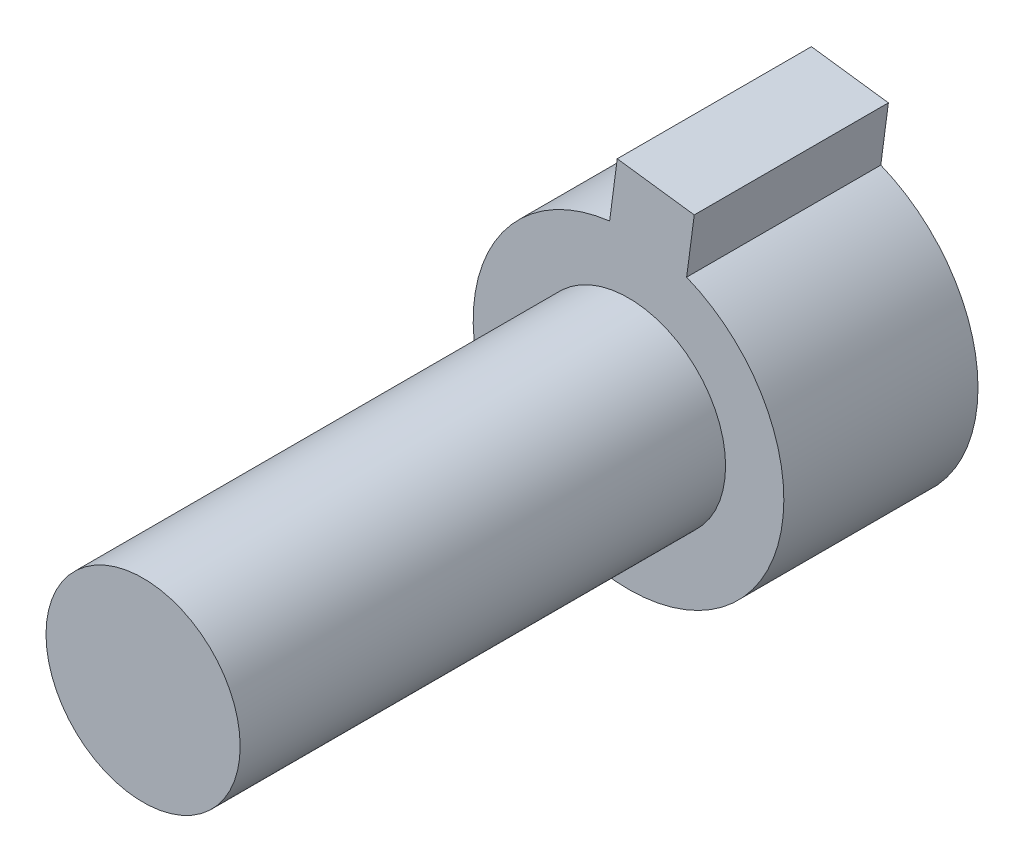
ISO-10303-21;
HEADER;
FILE_DESCRIPTION(('STEP AP214'),'2;1');
FILE_NAME('part.step','',(''),(''),'','','');
FILE_SCHEMA(('AUTOMOTIVE_DESIGN { 1 0 10303 214 1 1 1 1 }'));
ENDSEC;
DATA;
#1=APPLICATION_CONTEXT('core data for automotive mechanical design processes');
#2=APPLICATION_PROTOCOL_DEFINITION('international standard','automotive_design',2000,#1);
#3=PRODUCT_CONTEXT('',#1,'mechanical');
#4=PRODUCT('Part','Part','',(#3));
#5=PRODUCT_RELATED_PRODUCT_CATEGORY('part','',(#4));
#6=PRODUCT_DEFINITION_FORMATION('','',#4);
#7=PRODUCT_DEFINITION_CONTEXT('part definition',#1,'design');
#8=PRODUCT_DEFINITION('design','',#6,#7);
#9=PRODUCT_DEFINITION_SHAPE('','',#8);
#10=(LENGTH_UNIT() NAMED_UNIT(*) SI_UNIT(.MILLI.,.METRE.));
#11=(NAMED_UNIT(*) PLANE_ANGLE_UNIT() SI_UNIT($,.RADIAN.));
#12=(NAMED_UNIT(*) SI_UNIT($,.STERADIAN.) SOLID_ANGLE_UNIT());
#13=UNCERTAINTY_MEASURE_WITH_UNIT(LENGTH_MEASURE(1.E-05),#10,'distance_accuracy_value','');
#14=(GEOMETRIC_REPRESENTATION_CONTEXT(3) GLOBAL_UNCERTAINTY_ASSIGNED_CONTEXT((#13)) GLOBAL_UNIT_ASSIGNED_CONTEXT((#10,
#11,#12)) REPRESENTATION_CONTEXT('',''));
#15=CARTESIAN_POINT('',(0.,0.,0.));
#16=DIRECTION('',(0.,0.,1.));
#17=DIRECTION('',(1.,0.,0.));
#18=AXIS2_PLACEMENT_3D('',#15,#16,#17);
#19=CARTESIAN_POINT('',(3.38551983683199,10.3929810732487,10.));
#20=DIRECTION('',(-0.991444861373811,0.130526192220048,0.));
#21=DIRECTION('',(-0.130526192220048,-0.991444861373811,0.));
#22=AXIS2_PLACEMENT_3D('',#19,#20,#21);
#23=PLANE('',#22);
#24=DIRECTION('',(0.130526192220048,0.991444861373811,0.));
#25=VECTOR('',#24,1.);
#26=CARTESIAN_POINT('',(3.38551983683199,10.3929810732487,0.));
#27=LINE('',#26,#25);
#28=CARTESIAN_POINT('',(2.99394126017185,7.41864648912729,0.));
#29=VERTEX_POINT('',#28);
#30=CARTESIAN_POINT('',(3.38551983683199,10.3929810732487,0.));
#31=VERTEX_POINT('',#30);
#32=EDGE_CURVE('E95',#29,#31,#27,.T.);
#33=ORIENTED_EDGE('',*,*,#32,.T.);
#34=DIRECTION('',(0.,0.,-1.));
#35=VECTOR('',#34,1.);
#36=CARTESIAN_POINT('',(3.38551983683199,10.3929810732487,10.));
#37=LINE('',#36,#35);
#38=CARTESIAN_POINT('',(3.38551983683199,10.3929810732487,10.));
#39=VERTEX_POINT('',#38);
#40=EDGE_CURVE('E11',#39,#31,#37,.T.);
#41=ORIENTED_EDGE('',*,*,#40,.F.);
#42=DIRECTION('',(0.130526192220048,0.991444861373811,0.));
#43=VECTOR('',#42,1.);
#44=CARTESIAN_POINT('',(3.38551983683199,10.3929810732487,10.));
#45=LINE('',#44,#43);
#46=CARTESIAN_POINT('',(2.99394126017185,7.41864648912729,10.));
#47=VERTEX_POINT('',#46);
#48=EDGE_CURVE('E83',#47,#39,#45,.T.);
#49=ORIENTED_EDGE('',*,*,#48,.F.);
#50=DIRECTION('',(0.,0.,-1.));
#51=VECTOR('',#50,1.);
#52=CARTESIAN_POINT('',(2.99394126017185,7.41864648912729,10.));
#53=LINE('',#52,#51);
#54=EDGE_CURVE('E91',#47,#29,#53,.T.);
#55=ORIENTED_EDGE('',*,*,#54,.T.);
#56=EDGE_LOOP('',(#33,#41,#49,#55));
#57=FACE_BOUND('',#56,.T.);
#58=ADVANCED_FACE('F32',(#57),#23,.F.);
#59=CARTESIAN_POINT('',(-0.580259608663254,10.9150858421289,10.));
#60=DIRECTION('',(-0.130526192220048,-0.991444861373811,0.));
#61=DIRECTION('',(0.991444861373811,-0.130526192220048,0.));
#62=AXIS2_PLACEMENT_3D('',#59,#60,#61);
#63=PLANE('',#62);
#64=DIRECTION('',(-0.991444861373811,0.130526192220048,0.));
#65=VECTOR('',#64,1.);
#66=CARTESIAN_POINT('',(-0.580259608663254,10.9150858421289,0.));
#67=LINE('',#66,#65);
#68=CARTESIAN_POINT('',(-0.580259608663254,10.9150858421289,0.));
#69=VERTEX_POINT('',#68);
#70=EDGE_CURVE('E87',#31,#69,#67,.T.);
#71=ORIENTED_EDGE('',*,*,#70,.T.);
#72=DIRECTION('',(0.,0.,-1.));
#73=VECTOR('',#72,1.);
#74=CARTESIAN_POINT('',(-0.580259608663254,10.9150858421289,10.));
#75=LINE('',#74,#73);
#76=CARTESIAN_POINT('',(-0.580259608663254,10.9150858421289,10.));
#77=VERTEX_POINT('',#76);
#78=EDGE_CURVE('E40',#77,#69,#75,.T.);
#79=ORIENTED_EDGE('',*,*,#78,.F.);
#80=DIRECTION('',(-0.991444861373811,0.130526192220048,0.));
#81=VECTOR('',#80,1.);
#82=CARTESIAN_POINT('',(-0.580259608663254,10.9150858421289,10.));
#83=LINE('',#82,#81);
#84=EDGE_CURVE('E78',#39,#77,#83,.T.);
#85=ORIENTED_EDGE('',*,*,#84,.F.);
#86=ORIENTED_EDGE('',*,*,#40,.T.);
#87=EDGE_LOOP('',(#71,#79,#85,#86));
#88=FACE_BOUND('',#87,.T.);
#89=ADVANCED_FACE('F86',(#88),#63,.F.);
#90=CARTESIAN_POINT('',(-0.580259608663254,10.9150858421289,10.));
#91=DIRECTION('',(0.991444861373811,-0.130526192220045,0.));
#92=DIRECTION('',(0.130526192220045,0.991444861373811,0.));
#93=AXIS2_PLACEMENT_3D('',#90,#91,#92);
#94=PLANE('',#93);
#95=DIRECTION('',(-0.130526192220045,-0.991444861373811,0.));
#96=VECTOR('',#95,1.);
#97=CARTESIAN_POINT('',(-0.580259608663254,10.9150858421289,0.));
#98=LINE('',#97,#96);
#99=CARTESIAN_POINT('',(-0.971838185323389,7.94075125800748,0.));
#100=VERTEX_POINT('',#99);
#101=EDGE_CURVE('E65',#69,#100,#98,.T.);
#102=ORIENTED_EDGE('',*,*,#101,.T.);
#103=DIRECTION('',(0.,0.,-1.));
#104=VECTOR('',#103,1.);
#105=CARTESIAN_POINT('',(-0.971838185323389,7.94075125800748,10.));
#106=LINE('',#105,#104);
#107=CARTESIAN_POINT('',(-0.971838185323389,7.94075125800748,10.));
#108=VERTEX_POINT('',#107);
#109=EDGE_CURVE('E88',#108,#100,#106,.T.);
#110=ORIENTED_EDGE('',*,*,#109,.F.);
#111=DIRECTION('',(-0.130526192220045,-0.991444861373811,0.));
#112=VECTOR('',#111,1.);
#113=CARTESIAN_POINT('',(-0.580259608663254,10.9150858421289,10.));
#114=LINE('',#113,#112);
#115=EDGE_CURVE('E81',#77,#108,#114,.T.);
#116=ORIENTED_EDGE('',*,*,#115,.F.);
#117=ORIENTED_EDGE('',*,*,#78,.T.);
#118=EDGE_LOOP('',(#102,#110,#116,#117));
#119=FACE_BOUND('',#118,.T.);
#120=ADVANCED_FACE('F89',(#119),#94,.F.);
#121=CARTESIAN_POINT('',(0.,0.,10.));
#122=DIRECTION('',(0.,0.,-1.));
#123=DIRECTION('',(-1.,0.,0.));
#124=AXIS2_PLACEMENT_3D('',#121,#122,#123);
#125=CYLINDRICAL_SURFACE('',#124,8.);
#126=CARTESIAN_POINT('',(0.,0.,0.));
#127=DIRECTION('',(0.,0.,1.));
#128=DIRECTION('',(1.,0.,0.));
#129=AXIS2_PLACEMENT_3D('',#126,#127,#128);
#130=CIRCLE('',#129,8.);
#131=EDGE_CURVE('E71',#100,#29,#130,.T.);
#132=ORIENTED_EDGE('',*,*,#131,.T.);
#133=ORIENTED_EDGE('',*,*,#54,.F.);
#134=CARTESIAN_POINT('',(0.,0.,10.));
#135=DIRECTION('',(0.,0.,1.));
#136=DIRECTION('',(1.,0.,0.));
#137=AXIS2_PLACEMENT_3D('',#134,#135,#136);
#138=CIRCLE('',#137,8.);
#139=EDGE_CURVE('E48',#108,#47,#138,.T.);
#140=ORIENTED_EDGE('',*,*,#139,.F.);
#141=ORIENTED_EDGE('',*,*,#109,.T.);
#142=EDGE_LOOP('',(#132,#133,#140,#141));
#143=FACE_BOUND('',#142,.T.);
#144=ADVANCED_FACE('F103',(#143),#125,.T.);
#145=CARTESIAN_POINT('',(0.,0.,10.));
#146=DIRECTION('',(0.,0.,1.));
#147=DIRECTION('',(1.,0.,0.));
#148=AXIS2_PLACEMENT_3D('',#145,#146,#147);
#149=PLANE('',#148);
#150=CARTESIAN_POINT('',(0.,0.,10.));
#151=DIRECTION('',(0.,0.,1.));
#152=DIRECTION('',(1.,0.,0.));
#153=AXIS2_PLACEMENT_3D('',#150,#151,#152);
#154=CIRCLE('',#153,5.);
#155=CARTESIAN_POINT('',(5.,0.,10.));
#156=VERTEX_POINT('',#155);
#157=EDGE_CURVE('E109',#156,#156,#154,.T.);
#158=ORIENTED_EDGE('',*,*,#157,.F.);
#159=EDGE_LOOP('',(#158));
#160=FACE_BOUND('',#159,.T.);
#161=ORIENTED_EDGE('',*,*,#48,.T.);
#162=ORIENTED_EDGE('',*,*,#84,.T.);
#163=ORIENTED_EDGE('',*,*,#115,.T.);
#164=ORIENTED_EDGE('',*,*,#139,.T.);
#165=EDGE_LOOP('',(#161,#162,#163,#164));
#166=FACE_BOUND('',#165,.T.);
#167=ADVANCED_FACE('F79',(#160,#166),#149,.T.);
#168=CARTESIAN_POINT('',(0.,0.,0.));
#169=DIRECTION('',(0.,0.,1.));
#170=DIRECTION('',(1.,0.,0.));
#171=AXIS2_PLACEMENT_3D('',#168,#169,#170);
#172=PLANE('',#171);
#173=ORIENTED_EDGE('',*,*,#32,.F.);
#174=ORIENTED_EDGE('',*,*,#131,.F.);
#175=ORIENTED_EDGE('',*,*,#101,.F.);
#176=ORIENTED_EDGE('',*,*,#70,.F.);
#177=EDGE_LOOP('',(#173,#174,#175,#176));
#178=FACE_BOUND('',#177,.T.);
#179=ADVANCED_FACE('F106',(#178),#172,.F.);
#180=CARTESIAN_POINT('',(0.,0.,35.));
#181=DIRECTION('',(0.,0.,-1.));
#182=DIRECTION('',(-1.,0.,0.));
#183=AXIS2_PLACEMENT_3D('',#180,#181,#182);
#184=CYLINDRICAL_SURFACE('',#183,5.);
#185=CARTESIAN_POINT('',(0.,0.,35.));
#186=DIRECTION('',(0.,0.,1.));
#187=DIRECTION('',(1.,0.,0.));
#188=AXIS2_PLACEMENT_3D('',#185,#186,#187);
#189=CIRCLE('',#188,5.);
#190=CARTESIAN_POINT('',(5.,0.,35.));
#191=VERTEX_POINT('',#190);
#192=EDGE_CURVE('E98',#191,#191,#189,.T.);
#193=ORIENTED_EDGE('',*,*,#192,.F.);
#194=EDGE_LOOP('',(#193));
#195=FACE_BOUND('',#194,.T.);
#196=ORIENTED_EDGE('',*,*,#157,.T.);
#197=EDGE_LOOP('',(#196));
#198=FACE_BOUND('',#197,.T.);
#199=ADVANCED_FACE('F117',(#195,#198),#184,.T.);
#200=CARTESIAN_POINT('',(0.,0.,35.));
#201=DIRECTION('',(0.,0.,1.));
#202=DIRECTION('',(1.,0.,0.));
#203=AXIS2_PLACEMENT_3D('',#200,#201,#202);
#204=PLANE('',#203);
#205=ORIENTED_EDGE('',*,*,#192,.T.);
#206=EDGE_LOOP('',(#205));
#207=FACE_BOUND('',#206,.T.);
#208=ADVANCED_FACE('F115',(#207),#204,.T.);
#209=CLOSED_SHELL('',(#58,#89,#120,#144,#167,#179,#199,#208));
#210=MANIFOLD_SOLID_BREP('B2',#209);
#211=ADVANCED_BREP_SHAPE_REPRESENTATION('',(#18,#210),#14);
#212=SHAPE_DEFINITION_REPRESENTATION(#9,#211);
ENDSEC;
END-ISO-10303-21;
